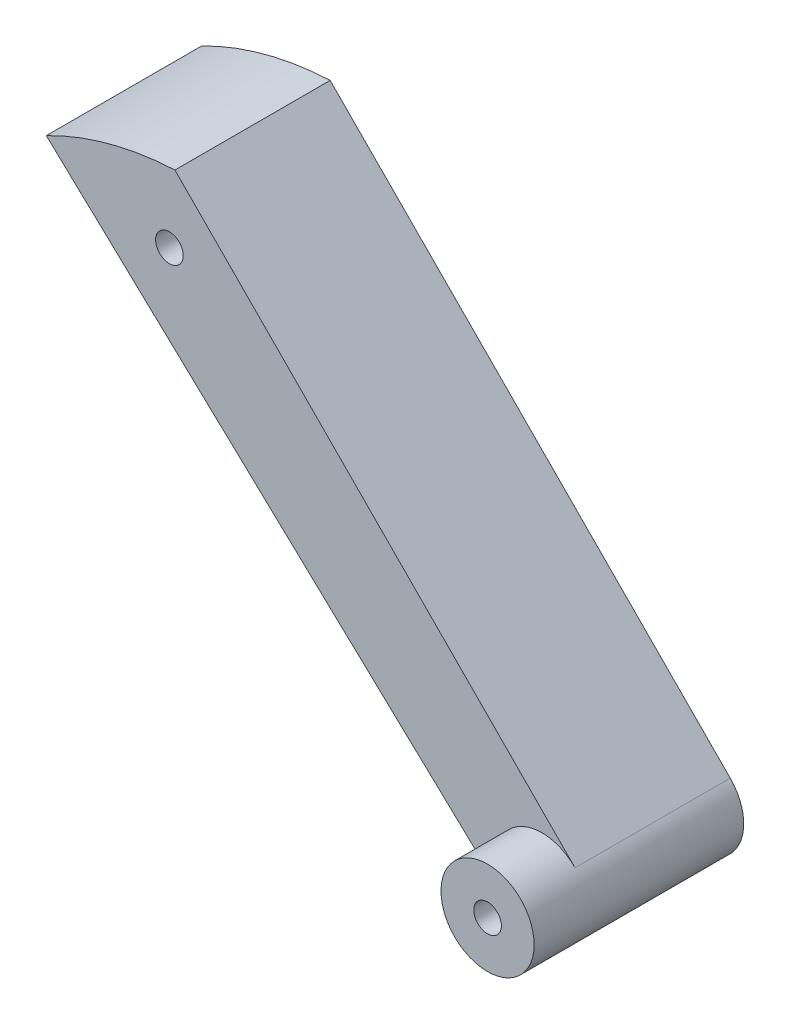
ISO-10303-21;
HEADER;
FILE_DESCRIPTION(('STEP AP214'),'2;1');
FILE_NAME('part.step','',(''),(''),'','','');
FILE_SCHEMA(('AUTOMOTIVE_DESIGN { 1 0 10303 214 1 1 1 1 }'));
ENDSEC;
DATA;
#1=APPLICATION_CONTEXT('core data for automotive mechanical design processes');
#2=APPLICATION_PROTOCOL_DEFINITION('international standard','automotive_design',2000,#1);
#3=PRODUCT_CONTEXT('',#1,'mechanical');
#4=PRODUCT('Part','Part','',(#3));
#5=PRODUCT_RELATED_PRODUCT_CATEGORY('part','',(#4));
#6=PRODUCT_DEFINITION_FORMATION('','',#4);
#7=PRODUCT_DEFINITION_CONTEXT('part definition',#1,'design');
#8=PRODUCT_DEFINITION('design','',#6,#7);
#9=PRODUCT_DEFINITION_SHAPE('','',#8);
#10=(LENGTH_UNIT() NAMED_UNIT(*) SI_UNIT(.MILLI.,.METRE.));
#11=(NAMED_UNIT(*) PLANE_ANGLE_UNIT() SI_UNIT($,.RADIAN.));
#12=(NAMED_UNIT(*) SI_UNIT($,.STERADIAN.) SOLID_ANGLE_UNIT());
#13=UNCERTAINTY_MEASURE_WITH_UNIT(LENGTH_MEASURE(1.E-05),#10,'distance_accuracy_value','');
#14=(GEOMETRIC_REPRESENTATION_CONTEXT(3) GLOBAL_UNCERTAINTY_ASSIGNED_CONTEXT((#13)) GLOBAL_UNIT_ASSIGNED_CONTEXT((#10,
#11,#12)) REPRESENTATION_CONTEXT('',''));
#15=CARTESIAN_POINT('',(0.,0.,0.));
#16=DIRECTION('',(0.,0.,1.));
#17=DIRECTION('',(1.,0.,0.));
#18=AXIS2_PLACEMENT_3D('',#15,#16,#17);
#19=CARTESIAN_POINT('',(298.23420508993,-2.48783731026282,12.7));
#20=DIRECTION('',(0.,0.,1.));
#21=DIRECTION('',(1.,0.,0.));
#22=AXIS2_PLACEMENT_3D('',#19,#20,#21);
#23=PLANE('',#22);
#24=CARTESIAN_POINT('',(296.61306637136,17.15430692576,12.7));
#25=DIRECTION('',(0.,0.,1.));
#26=DIRECTION('',(1.,0.,0.));
#27=AXIS2_PLACEMENT_3D('',#24,#25,#26);
#28=CIRCLE('',#27,1.13029999999997);
#29=CARTESIAN_POINT('',(297.74336637136,17.15430692576,12.7));
#30=VERTEX_POINT('',#29);
#31=EDGE_CURVE('E100',#30,#30,#28,.T.);
#32=ORIENTED_EDGE('',*,*,#31,.F.);
#33=EDGE_LOOP('',(#32));
#34=FACE_BOUND('',#33,.T.);
#35=DIRECTION('',(0.728201786135986,-0.685362793466614,0.));
#36=VECTOR('',#35,1.);
#37=CARTESIAN_POINT('',(286.5422230028,20.06116610314,12.7));
#38=LINE('',#37,#36);
#39=CARTESIAN_POINT('',(286.5422230028,20.06116610314,12.7));
#40=VERTEX_POINT('',#39);
#41=CARTESIAN_POINT('',(324.474632327244,-15.639737839253,12.7));
#42=VERTEX_POINT('',#41);
#43=EDGE_CURVE('E77',#40,#42,#38,.T.);
#44=ORIENTED_EDGE('',*,*,#43,.T.);
#45=CARTESIAN_POINT('',(327.085864570287,-12.8652890339992,12.7));
#46=DIRECTION('',(0.,0.,1.));
#47=DIRECTION('',(1.,0.,0.));
#48=AXIS2_PLACEMENT_3D('',#45,#46,#47);
#49=CIRCLE('',#48,3.81000000058685);
#50=CARTESIAN_POINT('',(329.79382741338,-10.1851701474541,12.7));
#51=VERTEX_POINT('',#50);
#52=EDGE_CURVE('E87',#42,#51,#49,.F.);
#53=ORIENTED_EDGE('',*,*,#52,.T.);
#54=DIRECTION('',(-0.703443277173111,0.710751402249728,0.));
#55=VECTOR('',#54,1.);
#56=CARTESIAN_POINT('',(297.063524693167,22.8851701479015,12.7));
#57=LINE('',#56,#55);
#58=CARTESIAN_POINT('',(297.063524693167,22.8851701479015,12.7));
#59=VERTEX_POINT('',#58);
#60=EDGE_CURVE('E48',#51,#59,#57,.T.);
#61=ORIENTED_EDGE('',*,*,#60,.T.);
#62=CARTESIAN_POINT('',(298.23420508993,-2.48783731026282,12.7));
#63=DIRECTION('',(0.,0.,1.));
#64=DIRECTION('',(1.,0.,0.));
#65=AXIS2_PLACEMENT_3D('',#62,#63,#64);
#66=CIRCLE('',#65,25.4000000012486);
#67=EDGE_CURVE('E106',#59,#40,#66,.T.);
#68=ORIENTED_EDGE('',*,*,#67,.T.);
#69=EDGE_LOOP('',(#44,#53,#61,#68));
#70=FACE_BOUND('',#69,.T.);
#71=ADVANCED_FACE('F31',(#34,#70),#23,.T.);
#72=CARTESIAN_POINT('',(298.23420508993,-2.48783731026282,0.));
#73=DIRECTION('',(0.,0.,1.));
#74=DIRECTION('',(1.,0.,0.));
#75=AXIS2_PLACEMENT_3D('',#72,#73,#74);
#76=PLANE('',#75);
#77=CARTESIAN_POINT('',(327.085864570656,-12.8652890337521,0.));
#78=DIRECTION('',(0.,0.,1.));
#79=DIRECTION('',(-1.,0.,0.));
#80=AXIS2_PLACEMENT_3D('',#77,#78,#79);
#81=CIRCLE('',#80,3.81000000044336);
#82=CARTESIAN_POINT('',(324.474632327244,-15.639737839253,0.));
#83=VERTEX_POINT('',#82);
#84=CARTESIAN_POINT('',(329.793827413542,-10.1851701474107,0.));
#85=VERTEX_POINT('',#84);
#86=EDGE_CURVE('E67',#83,#85,#81,.T.);
#87=ORIENTED_EDGE('',*,*,#86,.F.);
#88=DIRECTION('',(0.728201786135986,-0.685362793466614,0.));
#89=VECTOR('',#88,1.);
#90=CARTESIAN_POINT('',(286.5422230028,20.06116610314,0.));
#91=LINE('',#90,#89);
#92=CARTESIAN_POINT('',(286.5422230028,20.06116610314,0.));
#93=VERTEX_POINT('',#92);
#94=EDGE_CURVE('E111',#93,#83,#91,.T.);
#95=ORIENTED_EDGE('',*,*,#94,.F.);
#96=CARTESIAN_POINT('',(298.23420508993,-2.48783731026282,0.));
#97=DIRECTION('',(0.,0.,1.));
#98=DIRECTION('',(1.,0.,0.));
#99=AXIS2_PLACEMENT_3D('',#96,#97,#98);
#100=CIRCLE('',#99,25.4000000012486);
#101=CARTESIAN_POINT('',(297.063524693167,22.8851701479015,0.));
#102=VERTEX_POINT('',#101);
#103=EDGE_CURVE('E103',#102,#93,#100,.T.);
#104=ORIENTED_EDGE('',*,*,#103,.F.);
#105=DIRECTION('',(-0.703443277173111,0.710751402249728,0.));
#106=VECTOR('',#105,1.);
#107=CARTESIAN_POINT('',(297.063524693167,22.8851701479015,0.));
#108=LINE('',#107,#106);
#109=EDGE_CURVE('E72',#85,#102,#108,.T.);
#110=ORIENTED_EDGE('',*,*,#109,.F.);
#111=EDGE_LOOP('',(#87,#95,#104,#110));
#112=FACE_BOUND('',#111,.T.);
#113=CARTESIAN_POINT('',(327.085864570287,-12.8652890339992,0.));
#114=DIRECTION('',(0.,0.,1.));
#115=DIRECTION('',(1.,0.,0.));
#116=AXIS2_PLACEMENT_3D('',#113,#114,#115);
#117=CIRCLE('',#116,1.13029999937259);
#118=CARTESIAN_POINT('',(328.21616456966,-12.8652890339992,0.));
#119=VERTEX_POINT('',#118);
#120=EDGE_CURVE('E89',#119,#119,#117,.T.);
#121=ORIENTED_EDGE('',*,*,#120,.T.);
#122=EDGE_LOOP('',(#121));
#123=FACE_BOUND('',#122,.T.);
#124=CARTESIAN_POINT('',(296.61306637136,17.15430692576,0.));
#125=DIRECTION('',(0.,0.,1.));
#126=DIRECTION('',(1.,0.,0.));
#127=AXIS2_PLACEMENT_3D('',#124,#125,#126);
#128=CIRCLE('',#127,1.13029999999997);
#129=CARTESIAN_POINT('',(297.74336637136,17.15430692576,0.));
#130=VERTEX_POINT('',#129);
#131=EDGE_CURVE('E93',#130,#130,#128,.T.);
#132=ORIENTED_EDGE('',*,*,#131,.T.);
#133=EDGE_LOOP('',(#132));
#134=FACE_BOUND('',#133,.T.);
#135=ADVANCED_FACE('F116',(#112,#123,#134),#76,.F.);
#136=CARTESIAN_POINT('',(298.23420508993,-2.48783731026282,12.7));
#137=DIRECTION('',(0.,0.,-1.));
#138=DIRECTION('',(-1.,0.,0.));
#139=AXIS2_PLACEMENT_3D('',#136,#137,#138);
#140=CYLINDRICAL_SURFACE('',#139,25.4000000012486);
#141=ORIENTED_EDGE('',*,*,#103,.T.);
#142=DIRECTION('',(0.,0.,-1.));
#143=VECTOR('',#142,1.);
#144=CARTESIAN_POINT('',(286.5422230028,20.06116610314,12.7));
#145=LINE('',#144,#143);
#146=EDGE_CURVE('E11',#40,#93,#145,.T.);
#147=ORIENTED_EDGE('',*,*,#146,.F.);
#148=ORIENTED_EDGE('',*,*,#67,.F.);
#149=DIRECTION('',(0.,0.,-1.));
#150=VECTOR('',#149,1.);
#151=CARTESIAN_POINT('',(297.063524693167,22.8851701479015,12.7));
#152=LINE('',#151,#150);
#153=EDGE_CURVE('E81',#59,#102,#152,.T.);
#154=ORIENTED_EDGE('',*,*,#153,.T.);
#155=EDGE_LOOP('',(#141,#147,#148,#154));
#156=FACE_BOUND('',#155,.T.);
#157=ADVANCED_FACE('F33',(#156),#140,.T.);
#158=CARTESIAN_POINT('',(286.5422230028,20.06116610314,12.7));
#159=DIRECTION('',(0.685362793466614,0.728201786135986,0.));
#160=DIRECTION('',(-0.728201786135986,0.685362793466614,0.));
#161=AXIS2_PLACEMENT_3D('',#158,#159,#160);
#162=PLANE('',#161);
#163=ORIENTED_EDGE('',*,*,#94,.T.);
#164=DIRECTION('',(0.,0.,-1.));
#165=VECTOR('',#164,1.);
#166=CARTESIAN_POINT('',(324.474632327244,-15.639737839253,12.7));
#167=LINE('',#166,#165);
#168=EDGE_CURVE('E40',#42,#83,#167,.T.);
#169=ORIENTED_EDGE('',*,*,#168,.F.);
#170=ORIENTED_EDGE('',*,*,#43,.F.);
#171=ORIENTED_EDGE('',*,*,#146,.T.);
#172=EDGE_LOOP('',(#163,#169,#170,#171));
#173=FACE_BOUND('',#172,.T.);
#174=ADVANCED_FACE('F121',(#173),#162,.F.);
#175=CARTESIAN_POINT('',(327.085864570656,-12.8652890337521,12.7));
#176=DIRECTION('',(0.,0.,-1.));
#177=DIRECTION('',(-1.,0.,0.));
#178=AXIS2_PLACEMENT_3D('',#175,#176,#177);
#179=CYLINDRICAL_SURFACE('',#178,3.81000000044336);
#180=ORIENTED_EDGE('',*,*,#86,.T.);
#181=DIRECTION('',(0.,0.,-1.));
#182=VECTOR('',#181,1.);
#183=CARTESIAN_POINT('',(329.793827413542,-10.1851701474107,12.7));
#184=LINE('',#183,#182);
#185=EDGE_CURVE('E80',#51,#85,#184,.T.);
#186=ORIENTED_EDGE('',*,*,#185,.F.);
#187=ORIENTED_EDGE('',*,*,#52,.F.);
#188=ORIENTED_EDGE('',*,*,#168,.T.);
#189=EDGE_LOOP('',(#180,#186,#187,#188));
#190=FACE_BOUND('',#189,.T.);
#191=CARTESIAN_POINT('',(327.085864570287,-12.8652890339992,17.145));
#192=DIRECTION('',(0.,0.,1.));
#193=DIRECTION('',(1.,0.,0.));
#194=AXIS2_PLACEMENT_3D('',#191,#192,#193);
#195=CIRCLE('',#194,3.81000000058685);
#196=CARTESIAN_POINT('',(330.895864570874,-12.8652890339992,17.145));
#197=VERTEX_POINT('',#196);
#198=EDGE_CURVE('E90',#197,#197,#195,.T.);
#199=ORIENTED_EDGE('',*,*,#198,.F.);
#200=EDGE_LOOP('',(#199));
#201=FACE_BOUND('',#200,.T.);
#202=ADVANCED_FACE('F85',(#190,#201),#179,.T.);
#203=CARTESIAN_POINT('',(297.063524693167,22.8851701479015,12.7));
#204=DIRECTION('',(-0.710751402249728,-0.703443277173111,0.));
#205=DIRECTION('',(0.703443277173111,-0.710751402249728,0.));
#206=AXIS2_PLACEMENT_3D('',#203,#204,#205);
#207=PLANE('',#206);
#208=ORIENTED_EDGE('',*,*,#109,.T.);
#209=ORIENTED_EDGE('',*,*,#153,.F.);
#210=ORIENTED_EDGE('',*,*,#60,.F.);
#211=ORIENTED_EDGE('',*,*,#185,.T.);
#212=EDGE_LOOP('',(#208,#209,#210,#211));
#213=FACE_BOUND('',#212,.T.);
#214=ADVANCED_FACE('F79',(#213),#207,.F.);
#215=CARTESIAN_POINT('',(296.61306637136,17.15430692576,12.7));
#216=DIRECTION('',(0.,0.,-1.));
#217=DIRECTION('',(-1.,0.,0.));
#218=AXIS2_PLACEMENT_3D('',#215,#216,#217);
#219=CYLINDRICAL_SURFACE('',#218,1.13029999999997);
#220=ORIENTED_EDGE('',*,*,#31,.T.);
#221=EDGE_LOOP('',(#220));
#222=FACE_BOUND('',#221,.T.);
#223=ORIENTED_EDGE('',*,*,#131,.F.);
#224=EDGE_LOOP('',(#223));
#225=FACE_BOUND('',#224,.T.);
#226=ADVANCED_FACE('F137',(#222,#225),#219,.F.);
#227=CARTESIAN_POINT('',(327.085864570287,-12.8652890339992,12.7));
#228=DIRECTION('',(0.,0.,-1.));
#229=DIRECTION('',(-1.,0.,0.));
#230=AXIS2_PLACEMENT_3D('',#227,#228,#229);
#231=CYLINDRICAL_SURFACE('',#230,1.13029999937259);
#232=ORIENTED_EDGE('',*,*,#120,.F.);
#233=EDGE_LOOP('',(#232));
#234=FACE_BOUND('',#233,.T.);
#235=CARTESIAN_POINT('',(327.085864570287,-12.8652890339992,17.145));
#236=DIRECTION('',(0.,0.,1.));
#237=DIRECTION('',(1.,0.,0.));
#238=AXIS2_PLACEMENT_3D('',#235,#236,#237);
#239=CIRCLE('',#238,1.13029999937261);
#240=CARTESIAN_POINT('',(328.21616456966,-12.8652890339992,17.145));
#241=VERTEX_POINT('',#240);
#242=EDGE_CURVE('E96',#241,#241,#239,.T.);
#243=ORIENTED_EDGE('',*,*,#242,.T.);
#244=EDGE_LOOP('',(#243));
#245=FACE_BOUND('',#244,.T.);
#246=ADVANCED_FACE('F144',(#234,#245),#231,.F.);
#247=CARTESIAN_POINT('',(327.085864570287,-12.8652890339992,17.145));
#248=DIRECTION('',(0.,0.,1.));
#249=DIRECTION('',(1.,0.,0.));
#250=AXIS2_PLACEMENT_3D('',#247,#248,#249);
#251=PLANE('',#250);
#252=ORIENTED_EDGE('',*,*,#198,.T.);
#253=EDGE_LOOP('',(#252));
#254=FACE_BOUND('',#253,.T.);
#255=ORIENTED_EDGE('',*,*,#242,.F.);
#256=EDGE_LOOP('',(#255));
#257=FACE_BOUND('',#256,.T.);
#258=ADVANCED_FACE('F149',(#254,#257),#251,.T.);
#259=CLOSED_SHELL('',(#71,#135,#157,#174,#202,#214,#226,#246,#258));
#260=MANIFOLD_SOLID_BREP('B2',#259);
#261=ADVANCED_BREP_SHAPE_REPRESENTATION('',(#18,#260),#14);
#262=SHAPE_DEFINITION_REPRESENTATION(#9,#261);
ENDSEC;
END-ISO-10303-21;
